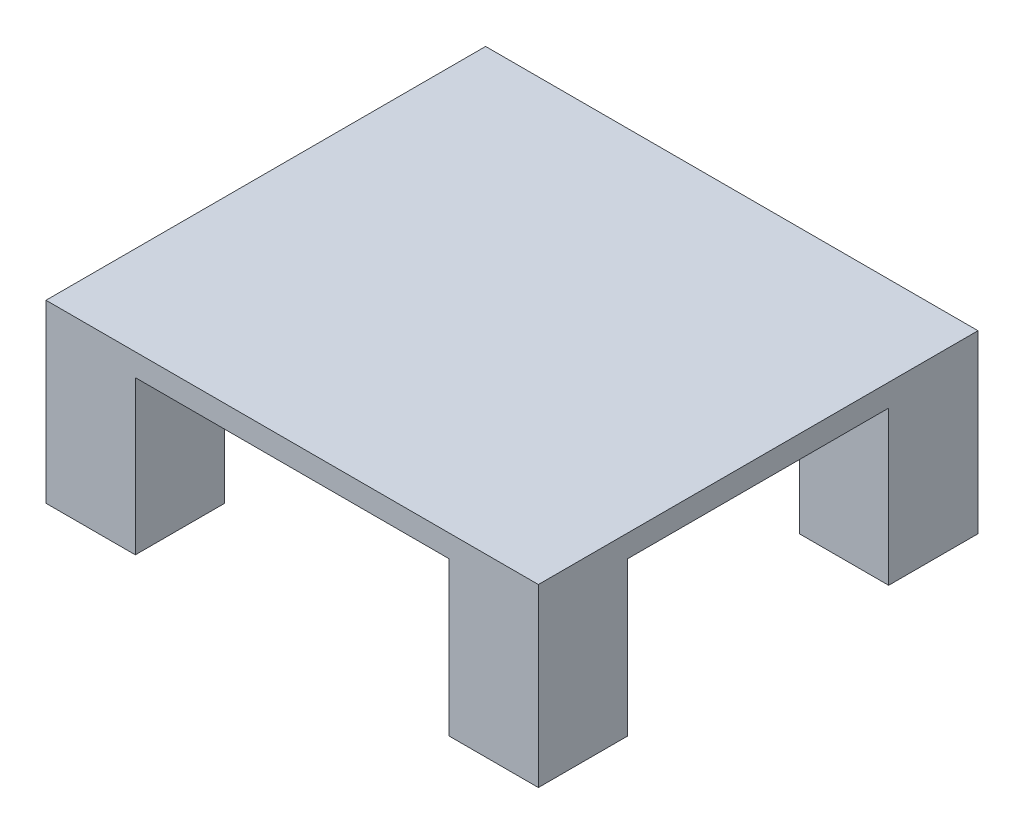
ISO-10303-21;
HEADER;
FILE_DESCRIPTION(('STEP AP214'),'2;1');
FILE_NAME('part.step','',(''),(''),'','','');
FILE_SCHEMA(('AUTOMOTIVE_DESIGN { 1 0 10303 214 1 1 1 1 }'));
ENDSEC;
DATA;
#1=APPLICATION_CONTEXT('core data for automotive mechanical design processes');
#2=APPLICATION_PROTOCOL_DEFINITION('international standard','automotive_design',2000,#1);
#3=PRODUCT_CONTEXT('',#1,'mechanical');
#4=PRODUCT('Part','Part','',(#3));
#5=PRODUCT_RELATED_PRODUCT_CATEGORY('part','',(#4));
#6=PRODUCT_DEFINITION_FORMATION('','',#4);
#7=PRODUCT_DEFINITION_CONTEXT('part definition',#1,'design');
#8=PRODUCT_DEFINITION('design','',#6,#7);
#9=PRODUCT_DEFINITION_SHAPE('','',#8);
#10=(LENGTH_UNIT() NAMED_UNIT(*) SI_UNIT(.MILLI.,.METRE.));
#11=(NAMED_UNIT(*) PLANE_ANGLE_UNIT() SI_UNIT($,.RADIAN.));
#12=(NAMED_UNIT(*) SI_UNIT($,.STERADIAN.) SOLID_ANGLE_UNIT());
#13=UNCERTAINTY_MEASURE_WITH_UNIT(LENGTH_MEASURE(1.E-05),#10,'distance_accuracy_value','');
#14=(GEOMETRIC_REPRESENTATION_CONTEXT(3) GLOBAL_UNCERTAINTY_ASSIGNED_CONTEXT((#13)) GLOBAL_UNIT_ASSIGNED_CONTEXT((#10,
#11,#12)) REPRESENTATION_CONTEXT('',''));
#15=CARTESIAN_POINT('',(0.,0.,0.));
#16=DIRECTION('',(0.,0.,1.));
#17=DIRECTION('',(1.,0.,0.));
#18=AXIS2_PLACEMENT_3D('',#15,#16,#17);
#19=CARTESIAN_POINT('',(0.,87.3,-280.287869876668));
#20=DIRECTION('',(0.,-1.,0.));
#21=DIRECTION('',(0.,0.,-1.));
#22=AXIS2_PLACEMENT_3D('',#19,#20,#21);
#23=PLANE('',#22);
#24=DIRECTION('',(0.,0.,1.));
#25=VECTOR('',#24,1.);
#26=CARTESIAN_POINT('',(280.,87.3,-280.287869876668));
#27=LINE('',#26,#25);
#28=CARTESIAN_POINT('',(280.,87.3,50.7999999999999));
#29=VERTEX_POINT('',#28);
#30=CARTESIAN_POINT('',(280.,87.3,199.2));
#31=VERTEX_POINT('',#30);
#32=EDGE_CURVE('E237',#29,#31,#27,.T.);
#33=ORIENTED_EDGE('',*,*,#32,.T.);
#34=DIRECTION('',(-1.,0.,0.));
#35=VECTOR('',#34,1.);
#36=CARTESIAN_POINT('',(0.,87.3,199.2));
#37=LINE('',#36,#35);
#38=CARTESIAN_POINT('',(229.2,87.3,199.2));
#39=VERTEX_POINT('',#38);
#40=EDGE_CURVE('E150',#31,#39,#37,.T.);
#41=ORIENTED_EDGE('',*,*,#40,.T.);
#42=DIRECTION('',(0.,0.,1.));
#43=VECTOR('',#42,1.);
#44=CARTESIAN_POINT('',(229.2,87.3,-280.287869876668));
#45=LINE('',#44,#43);
#46=CARTESIAN_POINT('',(229.2,87.3,250.));
#47=VERTEX_POINT('',#46);
#48=EDGE_CURVE('E154',#39,#47,#45,.T.);
#49=ORIENTED_EDGE('',*,*,#48,.T.);
#50=DIRECTION('',(1.,0.,0.));
#51=VECTOR('',#50,1.);
#52=CARTESIAN_POINT('',(0.,87.3,250.));
#53=LINE('',#52,#51);
#54=CARTESIAN_POINT('',(50.8,87.3,250.));
#55=VERTEX_POINT('',#54);
#56=EDGE_CURVE('E229',#55,#47,#53,.T.);
#57=ORIENTED_EDGE('',*,*,#56,.F.);
#58=DIRECTION('',(0.,0.,-1.));
#59=VECTOR('',#58,1.);
#60=CARTESIAN_POINT('',(50.8000000000001,87.3,-280.287869876668));
#61=LINE('',#60,#59);
#62=CARTESIAN_POINT('',(50.8,87.3,199.2));
#63=VERTEX_POINT('',#62);
#64=EDGE_CURVE('E198',#55,#63,#61,.T.);
#65=ORIENTED_EDGE('',*,*,#64,.T.);
#66=DIRECTION('',(-1.,0.,0.));
#67=VECTOR('',#66,1.);
#68=CARTESIAN_POINT('',(0.,87.3,199.2));
#69=LINE('',#68,#67);
#70=CARTESIAN_POINT('',(0.,87.3,199.2));
#71=VERTEX_POINT('',#70);
#72=EDGE_CURVE('E201',#63,#71,#69,.T.);
#73=ORIENTED_EDGE('',*,*,#72,.T.);
#74=DIRECTION('',(0.,0.,1.));
#75=VECTOR('',#74,1.);
#76=CARTESIAN_POINT('',(0.,87.3,-280.287869876668));
#77=LINE('',#76,#75);
#78=CARTESIAN_POINT('',(0.,87.3,50.8));
#79=VERTEX_POINT('',#78);
#80=EDGE_CURVE('E235',#79,#71,#77,.T.);
#81=ORIENTED_EDGE('',*,*,#80,.F.);
#82=DIRECTION('',(-1.,0.,0.));
#83=VECTOR('',#82,1.);
#84=CARTESIAN_POINT('',(0.,87.3,50.8));
#85=LINE('',#84,#83);
#86=CARTESIAN_POINT('',(50.8,87.3,50.8));
#87=VERTEX_POINT('',#86);
#88=EDGE_CURVE('E245',#87,#79,#85,.T.);
#89=ORIENTED_EDGE('',*,*,#88,.F.);
#90=DIRECTION('',(0.,0.,1.));
#91=VECTOR('',#90,1.);
#92=CARTESIAN_POINT('',(50.8,87.3,0.));
#93=LINE('',#92,#91);
#94=CARTESIAN_POINT('',(50.8,87.3,0.));
#95=VERTEX_POINT('',#94);
#96=EDGE_CURVE('E242',#95,#87,#93,.T.);
#97=ORIENTED_EDGE('',*,*,#96,.F.);
#98=DIRECTION('',(-1.,0.,0.));
#99=VECTOR('',#98,1.);
#100=CARTESIAN_POINT('',(1.26028120099004E-13,87.3,0.));
#101=LINE('',#100,#99);
#102=CARTESIAN_POINT('',(229.2,87.3,0.));
#103=VERTEX_POINT('',#102);
#104=EDGE_CURVE('E51',#103,#95,#101,.T.);
#105=ORIENTED_EDGE('',*,*,#104,.F.);
#106=DIRECTION('',(0.,0.,1.));
#107=VECTOR('',#106,1.);
#108=CARTESIAN_POINT('',(229.2,87.3,-280.287869876668));
#109=LINE('',#108,#107);
#110=CARTESIAN_POINT('',(229.2,87.3,50.7999999999999));
#111=VERTEX_POINT('',#110);
#112=EDGE_CURVE('E11',#103,#111,#109,.T.);
#113=ORIENTED_EDGE('',*,*,#112,.T.);
#114=DIRECTION('',(1.,0.,0.));
#115=VECTOR('',#114,1.);
#116=CARTESIAN_POINT('',(0.,87.3,50.8));
#117=LINE('',#116,#115);
#118=EDGE_CURVE('E222',#111,#29,#117,.T.);
#119=ORIENTED_EDGE('',*,*,#118,.T.);
#120=EDGE_LOOP('',(#33,#41,#49,#57,#65,#73,#81,#89,#97,#105,#113,#119));
#121=FACE_BOUND('',#120,.T.);
#122=ADVANCED_FACE('F33',(#121),#23,.T.);
#123=CARTESIAN_POINT('',(0.,100.,0.));
#124=DIRECTION('',(1.,0.,0.));
#125=DIRECTION('',(0.,0.,-1.));
#126=AXIS2_PLACEMENT_3D('',#123,#124,#125);
#127=PLANE('',#126);
#128=DIRECTION('',(0.,-1.,0.));
#129=VECTOR('',#128,1.);
#130=CARTESIAN_POINT('',(0.,100.,250.));
#131=LINE('',#130,#129);
#132=CARTESIAN_POINT('',(0.,100.,250.));
#133=VERTEX_POINT('',#132);
#134=CARTESIAN_POINT('',(0.,0.,250.));
#135=VERTEX_POINT('',#134);
#136=EDGE_CURVE('E224',#133,#135,#131,.T.);
#137=ORIENTED_EDGE('',*,*,#136,.F.);
#138=DIRECTION('',(0.,0.,1.));
#139=VECTOR('',#138,1.);
#140=CARTESIAN_POINT('',(0.,100.,0.));
#141=LINE('',#140,#139);
#142=CARTESIAN_POINT('',(0.,100.,0.));
#143=VERTEX_POINT('',#142);
#144=EDGE_CURVE('E249',#143,#133,#141,.T.);
#145=ORIENTED_EDGE('',*,*,#144,.F.);
#146=DIRECTION('',(0.,-1.,0.));
#147=VECTOR('',#146,1.);
#148=CARTESIAN_POINT('',(0.,100.,0.));
#149=LINE('',#148,#147);
#150=CARTESIAN_POINT('',(0.,0.,0.));
#151=VERTEX_POINT('',#150);
#152=EDGE_CURVE('E255',#143,#151,#149,.T.);
#153=ORIENTED_EDGE('',*,*,#152,.T.);
#154=DIRECTION('',(0.,0.,1.));
#155=VECTOR('',#154,1.);
#156=CARTESIAN_POINT('',(0.,0.,0.));
#157=LINE('',#156,#155);
#158=CARTESIAN_POINT('',(0.,0.,50.8));
#159=VERTEX_POINT('',#158);
#160=EDGE_CURVE('E248',#151,#159,#157,.T.);
#161=ORIENTED_EDGE('',*,*,#160,.T.);
#162=DIRECTION('',(0.,-1.,0.));
#163=VECTOR('',#162,1.);
#164=CARTESIAN_POINT('',(0.,100.,50.8));
#165=LINE('',#164,#163);
#166=EDGE_CURVE('E41',#79,#159,#165,.T.);
#167=ORIENTED_EDGE('',*,*,#166,.F.);
#168=ORIENTED_EDGE('',*,*,#80,.T.);
#169=DIRECTION('',(0.,-1.,0.));
#170=VECTOR('',#169,1.);
#171=CARTESIAN_POINT('',(0.,100.,199.2));
#172=LINE('',#171,#170);
#173=CARTESIAN_POINT('',(0.,0.,199.2));
#174=VERTEX_POINT('',#173);
#175=EDGE_CURVE('E192',#71,#174,#172,.T.);
#176=ORIENTED_EDGE('',*,*,#175,.T.);
#177=DIRECTION('',(0.,0.,1.));
#178=VECTOR('',#177,1.);
#179=CARTESIAN_POINT('',(0.,0.,250.));
#180=LINE('',#179,#178);
#181=EDGE_CURVE('E189',#174,#135,#180,.T.);
#182=ORIENTED_EDGE('',*,*,#181,.T.);
#183=EDGE_LOOP('',(#137,#145,#153,#161,#167,#168,#176,#182));
#184=FACE_BOUND('',#183,.T.);
#185=ADVANCED_FACE('F35',(#184),#127,.F.);
#186=CARTESIAN_POINT('',(0.,100.,50.8));
#187=DIRECTION('',(0.,0.,-1.));
#188=DIRECTION('',(-1.,0.,0.));
#189=AXIS2_PLACEMENT_3D('',#186,#187,#188);
#190=PLANE('',#189);
#191=DIRECTION('',(0.,-1.,0.));
#192=VECTOR('',#191,1.);
#193=CARTESIAN_POINT('',(50.8,100.,50.8));
#194=LINE('',#193,#192);
#195=CARTESIAN_POINT('',(50.8,0.,50.8));
#196=VERTEX_POINT('',#195);
#197=EDGE_CURVE('E269',#87,#196,#194,.T.);
#198=ORIENTED_EDGE('',*,*,#197,.F.);
#199=ORIENTED_EDGE('',*,*,#88,.T.);
#200=ORIENTED_EDGE('',*,*,#166,.T.);
#201=DIRECTION('',(1.,0.,0.));
#202=VECTOR('',#201,1.);
#203=CARTESIAN_POINT('',(0.,0.,50.8));
#204=LINE('',#203,#202);
#205=EDGE_CURVE('E258',#159,#196,#204,.T.);
#206=ORIENTED_EDGE('',*,*,#205,.T.);
#207=EDGE_LOOP('',(#198,#199,#200,#206));
#208=FACE_BOUND('',#207,.T.);
#209=ADVANCED_FACE('F274',(#208),#190,.F.);
#210=CARTESIAN_POINT('',(50.8,100.,0.));
#211=DIRECTION('',(-1.,0.,0.));
#212=DIRECTION('',(0.,0.,1.));
#213=AXIS2_PLACEMENT_3D('',#210,#211,#212);
#214=PLANE('',#213);
#215=DIRECTION('',(0.,-1.,0.));
#216=VECTOR('',#215,1.);
#217=CARTESIAN_POINT('',(50.8,100.,0.));
#218=LINE('',#217,#216);
#219=CARTESIAN_POINT('',(50.8,0.,0.));
#220=VERTEX_POINT('',#219);
#221=EDGE_CURVE('E267',#95,#220,#218,.T.);
#222=ORIENTED_EDGE('',*,*,#221,.F.);
#223=ORIENTED_EDGE('',*,*,#96,.T.);
#224=ORIENTED_EDGE('',*,*,#197,.T.);
#225=DIRECTION('',(0.,0.,-1.));
#226=VECTOR('',#225,1.);
#227=CARTESIAN_POINT('',(50.8,0.,0.));
#228=LINE('',#227,#226);
#229=EDGE_CURVE('E261',#196,#220,#228,.T.);
#230=ORIENTED_EDGE('',*,*,#229,.T.);
#231=EDGE_LOOP('',(#222,#223,#224,#230));
#232=FACE_BOUND('',#231,.T.);
#233=ADVANCED_FACE('F289',(#232),#214,.F.);
#234=CARTESIAN_POINT('',(0.,100.,0.));
#235=DIRECTION('',(0.,0.,1.));
#236=DIRECTION('',(1.,0.,0.));
#237=AXIS2_PLACEMENT_3D('',#234,#235,#236);
#238=PLANE('',#237);
#239=DIRECTION('',(0.,-1.,0.));
#240=VECTOR('',#239,1.);
#241=CARTESIAN_POINT('',(280.,100.,0.));
#242=LINE('',#241,#240);
#243=CARTESIAN_POINT('',(280.,100.,0.));
#244=VERTEX_POINT('',#243);
#245=CARTESIAN_POINT('',(280.,0.,0.));
#246=VERTEX_POINT('',#245);
#247=EDGE_CURVE('E225',#244,#246,#242,.T.);
#248=ORIENTED_EDGE('',*,*,#247,.T.);
#249=DIRECTION('',(-1.,0.,0.));
#250=VECTOR('',#249,1.);
#251=CARTESIAN_POINT('',(280.,0.,0.));
#252=LINE('',#251,#250);
#253=CARTESIAN_POINT('',(229.2,0.,0.));
#254=VERTEX_POINT('',#253);
#255=EDGE_CURVE('E204',#246,#254,#252,.T.);
#256=ORIENTED_EDGE('',*,*,#255,.T.);
#257=DIRECTION('',(0.,-1.,0.));
#258=VECTOR('',#257,1.);
#259=CARTESIAN_POINT('',(229.2,100.,0.));
#260=LINE('',#259,#258);
#261=EDGE_CURVE('E220',#103,#254,#260,.T.);
#262=ORIENTED_EDGE('',*,*,#261,.F.);
#263=ORIENTED_EDGE('',*,*,#104,.T.);
#264=ORIENTED_EDGE('',*,*,#221,.T.);
#265=DIRECTION('',(-1.,0.,0.));
#266=VECTOR('',#265,1.);
#267=CARTESIAN_POINT('',(0.,0.,0.));
#268=LINE('',#267,#266);
#269=EDGE_CURVE('E253',#220,#151,#268,.T.);
#270=ORIENTED_EDGE('',*,*,#269,.T.);
#271=ORIENTED_EDGE('',*,*,#152,.F.);
#272=DIRECTION('',(-1.,0.,0.));
#273=VECTOR('',#272,1.);
#274=CARTESIAN_POINT('',(0.,100.,0.));
#275=LINE('',#274,#273);
#276=EDGE_CURVE('E252',#244,#143,#275,.T.);
#277=ORIENTED_EDGE('',*,*,#276,.F.);
#278=EDGE_LOOP('',(#248,#256,#262,#263,#264,#270,#271,#277));
#279=FACE_BOUND('',#278,.T.);
#280=ADVANCED_FACE('F285',(#279),#238,.F.);
#281=CARTESIAN_POINT('',(0.,100.,0.));
#282=DIRECTION('',(0.,1.,0.));
#283=DIRECTION('',(0.,0.,1.));
#284=AXIS2_PLACEMENT_3D('',#281,#282,#283);
#285=PLANE('',#284);
#286=DIRECTION('',(-1.,0.,0.));
#287=VECTOR('',#286,1.);
#288=CARTESIAN_POINT('',(0.,100.,250.));
#289=LINE('',#288,#287);
#290=CARTESIAN_POINT('',(280.,100.,250.));
#291=VERTEX_POINT('',#290);
#292=EDGE_CURVE('E233',#291,#133,#289,.T.);
#293=ORIENTED_EDGE('',*,*,#292,.F.);
#294=DIRECTION('',(0.,0.,1.));
#295=VECTOR('',#294,1.);
#296=CARTESIAN_POINT('',(280.,100.,-280.287869876668));
#297=LINE('',#296,#295);
#298=EDGE_CURVE('E227',#244,#291,#297,.T.);
#299=ORIENTED_EDGE('',*,*,#298,.F.);
#300=ORIENTED_EDGE('',*,*,#276,.T.);
#301=ORIENTED_EDGE('',*,*,#144,.T.);
#302=EDGE_LOOP('',(#293,#299,#300,#301));
#303=FACE_BOUND('',#302,.T.);
#304=ADVANCED_FACE('F306',(#303),#285,.T.);
#305=CARTESIAN_POINT('',(0.,0.,0.));
#306=DIRECTION('',(0.,1.,0.));
#307=DIRECTION('',(0.,0.,1.));
#308=AXIS2_PLACEMENT_3D('',#305,#306,#307);
#309=PLANE('',#308);
#310=ORIENTED_EDGE('',*,*,#160,.F.);
#311=ORIENTED_EDGE('',*,*,#269,.F.);
#312=ORIENTED_EDGE('',*,*,#229,.F.);
#313=ORIENTED_EDGE('',*,*,#205,.F.);
#314=EDGE_LOOP('',(#310,#311,#312,#313));
#315=FACE_BOUND('',#314,.T.);
#316=ADVANCED_FACE('F279',(#315),#309,.F.);
#317=CARTESIAN_POINT('',(280.,100.,-280.287869876668));
#318=DIRECTION('',(1.,0.,0.));
#319=DIRECTION('',(0.,0.,-1.));
#320=AXIS2_PLACEMENT_3D('',#317,#318,#319);
#321=PLANE('',#320);
#322=DIRECTION('',(0.,1.,0.));
#323=VECTOR('',#322,1.);
#324=CARTESIAN_POINT('',(280.,100.,250.));
#325=LINE('',#324,#323);
#326=CARTESIAN_POINT('',(280.,0.,250.));
#327=VERTEX_POINT('',#326);
#328=EDGE_CURVE('E167',#327,#291,#325,.T.);
#329=ORIENTED_EDGE('',*,*,#328,.F.);
#330=DIRECTION('',(0.,0.,-1.));
#331=VECTOR('',#330,1.);
#332=CARTESIAN_POINT('',(280.,0.,250.));
#333=LINE('',#332,#331);
#334=CARTESIAN_POINT('',(280.,0.,199.2));
#335=VERTEX_POINT('',#334);
#336=EDGE_CURVE('E161',#327,#335,#333,.T.);
#337=ORIENTED_EDGE('',*,*,#336,.T.);
#338=DIRECTION('',(0.,-1.,0.));
#339=VECTOR('',#338,1.);
#340=CARTESIAN_POINT('',(280.,100.,199.2));
#341=LINE('',#340,#339);
#342=EDGE_CURVE('E143',#31,#335,#341,.T.);
#343=ORIENTED_EDGE('',*,*,#342,.F.);
#344=ORIENTED_EDGE('',*,*,#32,.F.);
#345=DIRECTION('',(0.,-1.,0.));
#346=VECTOR('',#345,1.);
#347=CARTESIAN_POINT('',(280.,100.,50.7999999999999));
#348=LINE('',#347,#346);
#349=CARTESIAN_POINT('',(280.,0.,50.7999999999999));
#350=VERTEX_POINT('',#349);
#351=EDGE_CURVE('E216',#29,#350,#348,.T.);
#352=ORIENTED_EDGE('',*,*,#351,.T.);
#353=DIRECTION('',(0.,0.,-1.));
#354=VECTOR('',#353,1.);
#355=CARTESIAN_POINT('',(280.,0.,0.));
#356=LINE('',#355,#354);
#357=EDGE_CURVE('E213',#350,#246,#356,.T.);
#358=ORIENTED_EDGE('',*,*,#357,.T.);
#359=ORIENTED_EDGE('',*,*,#247,.F.);
#360=ORIENTED_EDGE('',*,*,#298,.T.);
#361=EDGE_LOOP('',(#329,#337,#343,#344,#352,#358,#359,#360));
#362=FACE_BOUND('',#361,.T.);
#363=ADVANCED_FACE('F165',(#362),#321,.T.);
#364=CARTESIAN_POINT('',(0.,0.,250.));
#365=DIRECTION('',(0.,0.,1.));
#366=DIRECTION('',(1.,0.,0.));
#367=AXIS2_PLACEMENT_3D('',#364,#365,#366);
#368=PLANE('',#367);
#369=ORIENTED_EDGE('',*,*,#292,.T.);
#370=ORIENTED_EDGE('',*,*,#136,.T.);
#371=DIRECTION('',(1.,0.,0.));
#372=VECTOR('',#371,1.);
#373=CARTESIAN_POINT('',(0.,0.,250.));
#374=LINE('',#373,#372);
#375=CARTESIAN_POINT('',(50.8,0.,250.));
#376=VERTEX_POINT('',#375);
#377=EDGE_CURVE('E180',#135,#376,#374,.T.);
#378=ORIENTED_EDGE('',*,*,#377,.T.);
#379=DIRECTION('',(0.,-1.,0.));
#380=VECTOR('',#379,1.);
#381=CARTESIAN_POINT('',(50.8,100.,250.));
#382=LINE('',#381,#380);
#383=EDGE_CURVE('E196',#55,#376,#382,.T.);
#384=ORIENTED_EDGE('',*,*,#383,.F.);
#385=ORIENTED_EDGE('',*,*,#56,.T.);
#386=DIRECTION('',(0.,-1.,0.));
#387=VECTOR('',#386,1.);
#388=CARTESIAN_POINT('',(229.2,100.,250.));
#389=LINE('',#388,#387);
#390=CARTESIAN_POINT('',(229.2,0.,250.));
#391=VERTEX_POINT('',#390);
#392=EDGE_CURVE('E174',#47,#391,#389,.T.);
#393=ORIENTED_EDGE('',*,*,#392,.T.);
#394=DIRECTION('',(1.,0.,0.));
#395=VECTOR('',#394,1.);
#396=CARTESIAN_POINT('',(280.,0.,250.));
#397=LINE('',#396,#395);
#398=EDGE_CURVE('E172',#391,#327,#397,.T.);
#399=ORIENTED_EDGE('',*,*,#398,.T.);
#400=ORIENTED_EDGE('',*,*,#328,.T.);
#401=EDGE_LOOP('',(#369,#370,#378,#384,#385,#393,#399,#400));
#402=FACE_BOUND('',#401,.T.);
#403=ADVANCED_FACE('F301',(#402),#368,.T.);
#404=CARTESIAN_POINT('',(229.2,100.,0.));
#405=DIRECTION('',(1.,0.,0.));
#406=DIRECTION('',(0.,0.,-1.));
#407=AXIS2_PLACEMENT_3D('',#404,#405,#406);
#408=PLANE('',#407);
#409=ORIENTED_EDGE('',*,*,#112,.F.);
#410=ORIENTED_EDGE('',*,*,#261,.T.);
#411=DIRECTION('',(0.,0.,1.));
#412=VECTOR('',#411,1.);
#413=CARTESIAN_POINT('',(229.2,0.,0.));
#414=LINE('',#413,#412);
#415=CARTESIAN_POINT('',(229.2,0.,50.8));
#416=VERTEX_POINT('',#415);
#417=EDGE_CURVE('E207',#254,#416,#414,.T.);
#418=ORIENTED_EDGE('',*,*,#417,.T.);
#419=DIRECTION('',(0.,-1.,0.));
#420=VECTOR('',#419,1.);
#421=CARTESIAN_POINT('',(229.2,100.,50.8));
#422=LINE('',#421,#420);
#423=EDGE_CURVE('E218',#111,#416,#422,.T.);
#424=ORIENTED_EDGE('',*,*,#423,.F.);
#425=EDGE_LOOP('',(#409,#410,#418,#424));
#426=FACE_BOUND('',#425,.T.);
#427=ADVANCED_FACE('F316',(#426),#408,.F.);
#428=CARTESIAN_POINT('',(280.,100.,50.7999999999999));
#429=DIRECTION('',(0.,0.,-1.));
#430=DIRECTION('',(-1.,0.,0.));
#431=AXIS2_PLACEMENT_3D('',#428,#429,#430);
#432=PLANE('',#431);
#433=ORIENTED_EDGE('',*,*,#118,.F.);
#434=ORIENTED_EDGE('',*,*,#423,.T.);
#435=DIRECTION('',(1.,0.,0.));
#436=VECTOR('',#435,1.);
#437=CARTESIAN_POINT('',(280.,0.,50.7999999999999));
#438=LINE('',#437,#436);
#439=EDGE_CURVE('E210',#416,#350,#438,.T.);
#440=ORIENTED_EDGE('',*,*,#439,.T.);
#441=ORIENTED_EDGE('',*,*,#351,.F.);
#442=EDGE_LOOP('',(#433,#434,#440,#441));
#443=FACE_BOUND('',#442,.T.);
#444=ADVANCED_FACE('F319',(#443),#432,.F.);
#445=CARTESIAN_POINT('',(0.,0.,0.));
#446=DIRECTION('',(0.,1.,0.));
#447=DIRECTION('',(0.,0.,1.));
#448=AXIS2_PLACEMENT_3D('',#445,#446,#447);
#449=PLANE('',#448);
#450=ORIENTED_EDGE('',*,*,#255,.F.);
#451=ORIENTED_EDGE('',*,*,#357,.F.);
#452=ORIENTED_EDGE('',*,*,#439,.F.);
#453=ORIENTED_EDGE('',*,*,#417,.F.);
#454=EDGE_LOOP('',(#450,#451,#452,#453));
#455=FACE_BOUND('',#454,.T.);
#456=ADVANCED_FACE('F314',(#455),#449,.F.);
#457=CARTESIAN_POINT('',(50.8,100.,250.));
#458=DIRECTION('',(-1.,0.,0.));
#459=DIRECTION('',(0.,0.,1.));
#460=AXIS2_PLACEMENT_3D('',#457,#458,#459);
#461=PLANE('',#460);
#462=ORIENTED_EDGE('',*,*,#64,.F.);
#463=ORIENTED_EDGE('',*,*,#383,.T.);
#464=DIRECTION('',(0.,0.,-1.));
#465=VECTOR('',#464,1.);
#466=CARTESIAN_POINT('',(50.8,0.,250.));
#467=LINE('',#466,#465);
#468=CARTESIAN_POINT('',(50.8,0.,199.2));
#469=VERTEX_POINT('',#468);
#470=EDGE_CURVE('E183',#376,#469,#467,.T.);
#471=ORIENTED_EDGE('',*,*,#470,.T.);
#472=DIRECTION('',(0.,-1.,0.));
#473=VECTOR('',#472,1.);
#474=CARTESIAN_POINT('',(50.8,100.,199.2));
#475=LINE('',#474,#473);
#476=EDGE_CURVE('E194',#63,#469,#475,.T.);
#477=ORIENTED_EDGE('',*,*,#476,.F.);
#478=EDGE_LOOP('',(#462,#463,#471,#477));
#479=FACE_BOUND('',#478,.T.);
#480=ADVANCED_FACE('F394',(#479),#461,.F.);
#481=CARTESIAN_POINT('',(0.,100.,199.2));
#482=DIRECTION('',(0.,0.,1.));
#483=DIRECTION('',(1.,0.,0.));
#484=AXIS2_PLACEMENT_3D('',#481,#482,#483);
#485=PLANE('',#484);
#486=ORIENTED_EDGE('',*,*,#72,.F.);
#487=ORIENTED_EDGE('',*,*,#476,.T.);
#488=DIRECTION('',(-1.,0.,0.));
#489=VECTOR('',#488,1.);
#490=CARTESIAN_POINT('',(0.,0.,199.2));
#491=LINE('',#490,#489);
#492=EDGE_CURVE('E186',#469,#174,#491,.T.);
#493=ORIENTED_EDGE('',*,*,#492,.T.);
#494=ORIENTED_EDGE('',*,*,#175,.F.);
#495=EDGE_LOOP('',(#486,#487,#493,#494));
#496=FACE_BOUND('',#495,.T.);
#497=ADVANCED_FACE('F294',(#496),#485,.F.);
#498=CARTESIAN_POINT('',(0.,0.,0.));
#499=DIRECTION('',(0.,1.,0.));
#500=DIRECTION('',(0.,0.,1.));
#501=AXIS2_PLACEMENT_3D('',#498,#499,#500);
#502=PLANE('',#501);
#503=ORIENTED_EDGE('',*,*,#377,.F.);
#504=ORIENTED_EDGE('',*,*,#181,.F.);
#505=ORIENTED_EDGE('',*,*,#492,.F.);
#506=ORIENTED_EDGE('',*,*,#470,.F.);
#507=EDGE_LOOP('',(#503,#504,#505,#506));
#508=FACE_BOUND('',#507,.T.);
#509=ADVANCED_FACE('F298',(#508),#502,.F.);
#510=CARTESIAN_POINT('',(280.,100.,199.2));
#511=DIRECTION('',(0.,0.,1.));
#512=DIRECTION('',(1.,0.,0.));
#513=AXIS2_PLACEMENT_3D('',#510,#511,#512);
#514=PLANE('',#513);
#515=ORIENTED_EDGE('',*,*,#40,.F.);
#516=ORIENTED_EDGE('',*,*,#342,.T.);
#517=DIRECTION('',(-1.,0.,0.));
#518=VECTOR('',#517,1.);
#519=CARTESIAN_POINT('',(280.,0.,199.2));
#520=LINE('',#519,#518);
#521=CARTESIAN_POINT('',(229.2,0.,199.2));
#522=VERTEX_POINT('',#521);
#523=EDGE_CURVE('E147',#335,#522,#520,.T.);
#524=ORIENTED_EDGE('',*,*,#523,.T.);
#525=DIRECTION('',(0.,-1.,0.));
#526=VECTOR('',#525,1.);
#527=CARTESIAN_POINT('',(229.2,100.,199.2));
#528=LINE('',#527,#526);
#529=EDGE_CURVE('E155',#39,#522,#528,.T.);
#530=ORIENTED_EDGE('',*,*,#529,.F.);
#531=EDGE_LOOP('',(#515,#516,#524,#530));
#532=FACE_BOUND('',#531,.T.);
#533=ADVANCED_FACE('F145',(#532),#514,.F.);
#534=CARTESIAN_POINT('',(229.2,100.,250.));
#535=DIRECTION('',(1.,0.,0.));
#536=DIRECTION('',(0.,0.,-1.));
#537=AXIS2_PLACEMENT_3D('',#534,#535,#536);
#538=PLANE('',#537);
#539=ORIENTED_EDGE('',*,*,#48,.F.);
#540=ORIENTED_EDGE('',*,*,#529,.T.);
#541=DIRECTION('',(0.,0.,1.));
#542=VECTOR('',#541,1.);
#543=CARTESIAN_POINT('',(229.2,0.,250.));
#544=LINE('',#543,#542);
#545=EDGE_CURVE('E163',#522,#391,#544,.T.);
#546=ORIENTED_EDGE('',*,*,#545,.T.);
#547=ORIENTED_EDGE('',*,*,#392,.F.);
#548=EDGE_LOOP('',(#539,#540,#546,#547));
#549=FACE_BOUND('',#548,.T.);
#550=ADVANCED_FACE('F321',(#549),#538,.F.);
#551=CARTESIAN_POINT('',(0.,0.,0.));
#552=DIRECTION('',(0.,1.,0.));
#553=DIRECTION('',(0.,0.,1.));
#554=AXIS2_PLACEMENT_3D('',#551,#552,#553);
#555=PLANE('',#554);
#556=ORIENTED_EDGE('',*,*,#336,.F.);
#557=ORIENTED_EDGE('',*,*,#398,.F.);
#558=ORIENTED_EDGE('',*,*,#545,.F.);
#559=ORIENTED_EDGE('',*,*,#523,.F.);
#560=EDGE_LOOP('',(#556,#557,#558,#559));
#561=FACE_BOUND('',#560,.T.);
#562=ADVANCED_FACE('F159',(#561),#555,.F.);
#563=CLOSED_SHELL('',(#122,#185,#209,#233,#280,#304,#316,#363,#403,#427,#444,#456,#480,#497,
#509,#533,#550,#562));
#564=MANIFOLD_SOLID_BREP('B2',#563);
#565=ADVANCED_BREP_SHAPE_REPRESENTATION('',(#18,#564),#14);
#566=SHAPE_DEFINITION_REPRESENTATION(#9,#565);
ENDSEC;
END-ISO-10303-21;
